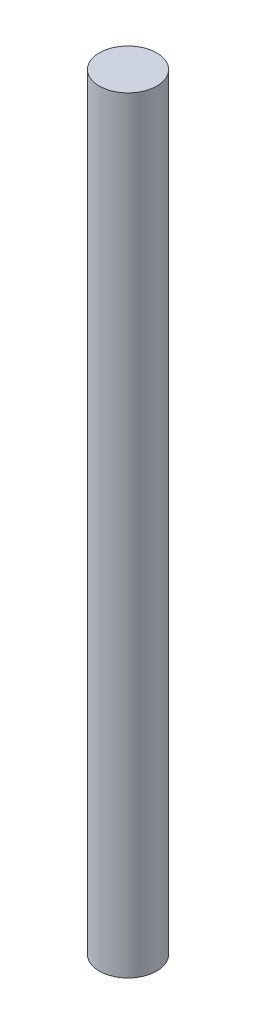
ISO-10303-21;
HEADER;
FILE_DESCRIPTION(('STEP AP214'),'2;1');
FILE_NAME('part.step','',(''),(''),'','','');
FILE_SCHEMA(('AUTOMOTIVE_DESIGN { 1 0 10303 214 1 1 1 1 }'));
ENDSEC;
DATA;
#1=APPLICATION_CONTEXT('core data for automotive mechanical design processes');
#2=APPLICATION_PROTOCOL_DEFINITION('international standard','automotive_design',2000,#1);
#3=PRODUCT_CONTEXT('',#1,'mechanical');
#4=PRODUCT('Part','Part','',(#3));
#5=PRODUCT_RELATED_PRODUCT_CATEGORY('part','',(#4));
#6=PRODUCT_DEFINITION_FORMATION('','',#4);
#7=PRODUCT_DEFINITION_CONTEXT('part definition',#1,'design');
#8=PRODUCT_DEFINITION('design','',#6,#7);
#9=PRODUCT_DEFINITION_SHAPE('','',#8);
#10=(LENGTH_UNIT() NAMED_UNIT(*) SI_UNIT(.MILLI.,.METRE.));
#11=(NAMED_UNIT(*) PLANE_ANGLE_UNIT() SI_UNIT($,.RADIAN.));
#12=(NAMED_UNIT(*) SI_UNIT($,.STERADIAN.) SOLID_ANGLE_UNIT());
#13=UNCERTAINTY_MEASURE_WITH_UNIT(LENGTH_MEASURE(1.E-05),#10,'distance_accuracy_value','');
#14=(GEOMETRIC_REPRESENTATION_CONTEXT(3) GLOBAL_UNCERTAINTY_ASSIGNED_CONTEXT((#13)) GLOBAL_UNIT_ASSIGNED_CONTEXT((#10,
#11,#12)) REPRESENTATION_CONTEXT('',''));
#15=CARTESIAN_POINT('',(0.,0.,0.));
#16=DIRECTION('',(0.,0.,1.));
#17=DIRECTION('',(1.,0.,0.));
#18=AXIS2_PLACEMENT_3D('',#15,#16,#17);
#19=CARTESIAN_POINT('',(-33.1292946887061,40.,36.9420538804661));
#20=DIRECTION('',(0.,-1.,0.));
#21=DIRECTION('',(0.,0.,-1.));
#22=AXIS2_PLACEMENT_3D('',#19,#20,#21);
#23=CYLINDRICAL_SURFACE('',#22,1.5);
#24=CARTESIAN_POINT('',(-33.1292946887061,40.,36.9420538804661));
#25=DIRECTION('',(0.,-1.,0.));
#26=DIRECTION('',(0.,0.,-1.));
#27=AXIS2_PLACEMENT_3D('',#24,#25,#26);
#28=CIRCLE('',#27,1.5);
#29=CARTESIAN_POINT('',(-33.1292946887061,40.,35.4420538804661));
#30=VERTEX_POINT('',#29);
#31=EDGE_CURVE('E10',#30,#30,#28,.T.);
#32=ORIENTED_EDGE('',*,*,#31,.T.);
#33=EDGE_LOOP('',(#32));
#34=FACE_BOUND('',#33,.T.);
#35=CARTESIAN_POINT('',(-33.1292946887061,0.,36.9420538804661));
#36=DIRECTION('',(0.,-1.,0.));
#37=DIRECTION('',(0.,0.,-1.));
#38=AXIS2_PLACEMENT_3D('',#35,#36,#37);
#39=CIRCLE('',#38,1.5);
#40=CARTESIAN_POINT('',(-33.1292946887061,0.,35.4420538804661));
#41=VERTEX_POINT('',#40);
#42=EDGE_CURVE('E39',#41,#41,#39,.T.);
#43=ORIENTED_EDGE('',*,*,#42,.F.);
#44=EDGE_LOOP('',(#43));
#45=FACE_BOUND('',#44,.T.);
#46=ADVANCED_FACE('F33',(#34,#45),#23,.T.);
#47=CARTESIAN_POINT('',(-31.6292946887061,40.,36.9420538804661));
#48=DIRECTION('',(0.,1.,0.));
#49=DIRECTION('',(0.,0.,1.));
#50=AXIS2_PLACEMENT_3D('',#47,#48,#49);
#51=PLANE('',#50);
#52=ORIENTED_EDGE('',*,*,#31,.F.);
#53=EDGE_LOOP('',(#52));
#54=FACE_BOUND('',#53,.T.);
#55=ADVANCED_FACE('F48',(#54),#51,.T.);
#56=CARTESIAN_POINT('',(-33.1292946887061,0.,36.9420538804661));
#57=DIRECTION('',(0.,-1.,0.));
#58=DIRECTION('',(0.,0.,-1.));
#59=AXIS2_PLACEMENT_3D('',#56,#57,#58);
#60=PLANE('',#59);
#61=ORIENTED_EDGE('',*,*,#42,.T.);
#62=EDGE_LOOP('',(#61));
#63=FACE_BOUND('',#62,.T.);
#64=ADVANCED_FACE('F45',(#63),#60,.T.);
#65=CLOSED_SHELL('',(#46,#55,#64));
#66=MANIFOLD_SOLID_BREP('B2',#65);
#67=ADVANCED_BREP_SHAPE_REPRESENTATION('',(#18,#66),#14);
#68=SHAPE_DEFINITION_REPRESENTATION(#9,#67);
ENDSEC;
END-ISO-10303-21;
